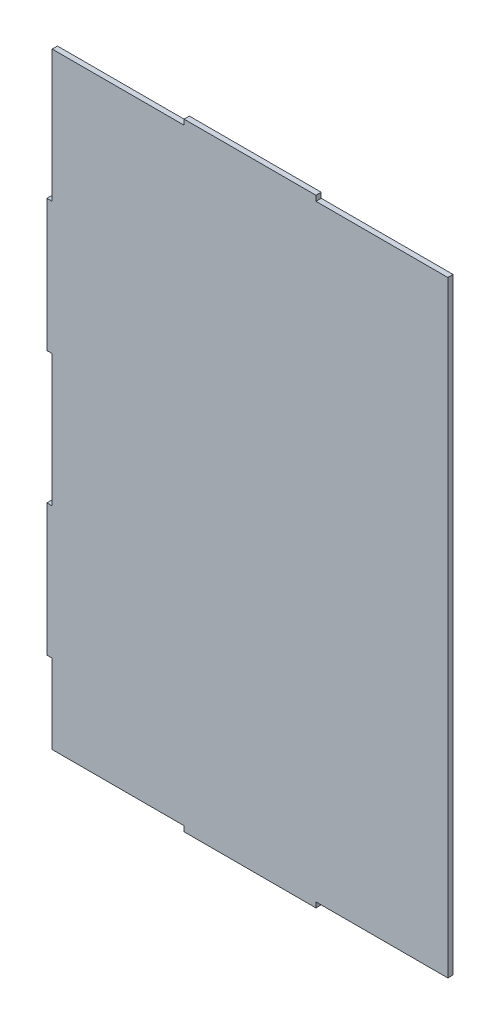
ISO-10303-21;
HEADER;
FILE_DESCRIPTION(('STEP AP214'),'2;1');
FILE_NAME('part.step','',(''),(''),'','','');
FILE_SCHEMA(('AUTOMOTIVE_DESIGN { 1 0 10303 214 1 1 1 1 }'));
ENDSEC;
DATA;
#1=APPLICATION_CONTEXT('core data for automotive mechanical design processes');
#2=APPLICATION_PROTOCOL_DEFINITION('international standard','automotive_design',2000,#1);
#3=PRODUCT_CONTEXT('',#1,'mechanical');
#4=PRODUCT('Part','Part','',(#3));
#5=PRODUCT_RELATED_PRODUCT_CATEGORY('part','',(#4));
#6=PRODUCT_DEFINITION_FORMATION('','',#4);
#7=PRODUCT_DEFINITION_CONTEXT('part definition',#1,'design');
#8=PRODUCT_DEFINITION('design','',#6,#7);
#9=PRODUCT_DEFINITION_SHAPE('','',#8);
#10=(LENGTH_UNIT() NAMED_UNIT(*) SI_UNIT(.MILLI.,.METRE.));
#11=(NAMED_UNIT(*) PLANE_ANGLE_UNIT() SI_UNIT($,.RADIAN.));
#12=(NAMED_UNIT(*) SI_UNIT($,.STERADIAN.) SOLID_ANGLE_UNIT());
#13=UNCERTAINTY_MEASURE_WITH_UNIT(LENGTH_MEASURE(1.E-05),#10,'distance_accuracy_value','');
#14=(GEOMETRIC_REPRESENTATION_CONTEXT(3) GLOBAL_UNCERTAINTY_ASSIGNED_CONTEXT((#13)) GLOBAL_UNIT_ASSIGNED_CONTEXT((#10,
#11,#12)) REPRESENTATION_CONTEXT('',''));
#15=CARTESIAN_POINT('',(0.,0.,0.));
#16=DIRECTION('',(0.,0.,1.));
#17=DIRECTION('',(1.,0.,0.));
#18=AXIS2_PLACEMENT_3D('',#15,#16,#17);
#19=CARTESIAN_POINT('',(323.463115997168,308.167929075056,4.));
#20=DIRECTION('',(1.,0.,0.));
#21=DIRECTION('',(0.,0.,-1.));
#22=AXIS2_PLACEMENT_3D('',#19,#20,#21);
#23=PLANE('',#22);
#24=DIRECTION('',(0.,-1.,0.));
#25=VECTOR('',#24,1.);
#26=CARTESIAN_POINT('',(323.463115997168,308.167929075056,0.));
#27=LINE('',#26,#25);
#28=CARTESIAN_POINT('',(323.463115997168,308.167929075056,0.));
#29=VERTEX_POINT('',#28);
#30=CARTESIAN_POINT('',(323.463115997168,208.167929075056,0.));
#31=VERTEX_POINT('',#30);
#32=EDGE_CURVE('E203',#29,#31,#27,.T.);
#33=ORIENTED_EDGE('',*,*,#32,.T.);
#34=DIRECTION('',(0.,0.,-1.));
#35=VECTOR('',#34,1.);
#36=CARTESIAN_POINT('',(323.463115997168,208.167929075056,4.));
#37=LINE('',#36,#35);
#38=CARTESIAN_POINT('',(323.463115997168,208.167929075056,4.));
#39=VERTEX_POINT('',#38);
#40=EDGE_CURVE('E11',#39,#31,#37,.T.);
#41=ORIENTED_EDGE('',*,*,#40,.F.);
#42=DIRECTION('',(0.,-1.,0.));
#43=VECTOR('',#42,1.);
#44=CARTESIAN_POINT('',(323.463115997168,308.167929075056,4.));
#45=LINE('',#44,#43);
#46=CARTESIAN_POINT('',(323.463115997168,308.167929075056,4.));
#47=VERTEX_POINT('',#46);
#48=EDGE_CURVE('E242',#47,#39,#45,.T.);
#49=ORIENTED_EDGE('',*,*,#48,.F.);
#50=DIRECTION('',(0.,0.,-1.));
#51=VECTOR('',#50,1.);
#52=CARTESIAN_POINT('',(323.463115997168,308.167929075056,4.));
#53=LINE('',#52,#51);
#54=EDGE_CURVE('E199',#47,#29,#53,.T.);
#55=ORIENTED_EDGE('',*,*,#54,.T.);
#56=EDGE_LOOP('',(#33,#41,#49,#55));
#57=FACE_BOUND('',#56,.T.);
#58=ADVANCED_FACE('F35',(#57),#23,.F.);
#59=CARTESIAN_POINT('',(323.463115997168,208.167929075056,4.));
#60=DIRECTION('',(0.,1.,0.));
#61=DIRECTION('',(0.,0.,1.));
#62=AXIS2_PLACEMENT_3D('',#59,#60,#61);
#63=PLANE('',#62);
#64=DIRECTION('',(1.,0.,0.));
#65=VECTOR('',#64,1.);
#66=CARTESIAN_POINT('',(323.463115997168,208.167929075056,0.));
#67=LINE('',#66,#65);
#68=CARTESIAN_POINT('',(327.463115997168,208.167929075056,0.));
#69=VERTEX_POINT('',#68);
#70=EDGE_CURVE('E206',#31,#69,#67,.T.);
#71=ORIENTED_EDGE('',*,*,#70,.T.);
#72=DIRECTION('',(0.,0.,-1.));
#73=VECTOR('',#72,1.);
#74=CARTESIAN_POINT('',(327.463115997168,208.167929075056,4.));
#75=LINE('',#74,#73);
#76=CARTESIAN_POINT('',(327.463115997168,208.167929075056,4.));
#77=VERTEX_POINT('',#76);
#78=EDGE_CURVE('E43',#77,#69,#75,.T.);
#79=ORIENTED_EDGE('',*,*,#78,.F.);
#80=DIRECTION('',(1.,0.,0.));
#81=VECTOR('',#80,1.);
#82=CARTESIAN_POINT('',(323.463115997168,208.167929075056,4.));
#83=LINE('',#82,#81);
#84=EDGE_CURVE('E130',#39,#77,#83,.T.);
#85=ORIENTED_EDGE('',*,*,#84,.F.);
#86=ORIENTED_EDGE('',*,*,#40,.T.);
#87=EDGE_LOOP('',(#71,#79,#85,#86));
#88=FACE_BOUND('',#87,.T.);
#89=ADVANCED_FACE('F360',(#88),#63,.F.);
#90=CARTESIAN_POINT('',(327.463115997168,208.167929075056,4.));
#91=DIRECTION('',(1.,0.,0.));
#92=DIRECTION('',(0.,1.,0.));
#93=AXIS2_PLACEMENT_3D('',#90,#91,#92);
#94=PLANE('',#93);
#95=DIRECTION('',(0.,-1.,0.));
#96=VECTOR('',#95,1.);
#97=CARTESIAN_POINT('',(327.463115997168,208.167929075056,0.));
#98=LINE('',#97,#96);
#99=CARTESIAN_POINT('',(327.463115997166,148.167929075056,0.));
#100=VERTEX_POINT('',#99);
#101=EDGE_CURVE('E208',#69,#100,#98,.T.);
#102=ORIENTED_EDGE('',*,*,#101,.T.);
#103=DIRECTION('',(0.,0.,-1.));
#104=VECTOR('',#103,1.);
#105=CARTESIAN_POINT('',(327.463115997166,148.167929075056,4.));
#106=LINE('',#105,#104);
#107=CARTESIAN_POINT('',(327.463115997166,148.167929075056,4.));
#108=VERTEX_POINT('',#107);
#109=EDGE_CURVE('E285',#108,#100,#106,.T.);
#110=ORIENTED_EDGE('',*,*,#109,.F.);
#111=DIRECTION('',(0.,-1.,0.));
#112=VECTOR('',#111,1.);
#113=CARTESIAN_POINT('',(327.463115997168,208.167929075056,4.));
#114=LINE('',#113,#112);
#115=EDGE_CURVE('E293',#77,#108,#114,.T.);
#116=ORIENTED_EDGE('',*,*,#115,.F.);
#117=ORIENTED_EDGE('',*,*,#78,.T.);
#118=EDGE_LOOP('',(#102,#110,#116,#117));
#119=FACE_BOUND('',#118,.T.);
#120=ADVANCED_FACE('F291',(#119),#94,.F.);
#121=CARTESIAN_POINT('',(327.463115997166,148.167929075056,4.));
#122=DIRECTION('',(0.,1.,0.));
#123=DIRECTION('',(0.,0.,1.));
#124=AXIS2_PLACEMENT_3D('',#121,#122,#123);
#125=PLANE('',#124);
#126=DIRECTION('',(1.,0.,0.));
#127=VECTOR('',#126,1.);
#128=CARTESIAN_POINT('',(327.463115997166,148.167929075056,0.));
#129=LINE('',#128,#127);
#130=CARTESIAN_POINT('',(427.463115997166,148.167929075056,0.));
#131=VERTEX_POINT('',#130);
#132=EDGE_CURVE('E210',#100,#131,#129,.T.);
#133=ORIENTED_EDGE('',*,*,#132,.T.);
#134=DIRECTION('',(0.,0.,-1.));
#135=VECTOR('',#134,1.);
#136=CARTESIAN_POINT('',(427.463115997166,148.167929075056,4.));
#137=LINE('',#136,#135);
#138=CARTESIAN_POINT('',(427.463115997166,148.167929075056,4.));
#139=VERTEX_POINT('',#138);
#140=EDGE_CURVE('E282',#139,#131,#137,.T.);
#141=ORIENTED_EDGE('',*,*,#140,.F.);
#142=DIRECTION('',(1.,0.,0.));
#143=VECTOR('',#142,1.);
#144=CARTESIAN_POINT('',(327.463115997166,148.167929075056,4.));
#145=LINE('',#144,#143);
#146=EDGE_CURVE('E311',#108,#139,#145,.T.);
#147=ORIENTED_EDGE('',*,*,#146,.F.);
#148=ORIENTED_EDGE('',*,*,#109,.T.);
#149=EDGE_LOOP('',(#133,#141,#147,#148));
#150=FACE_BOUND('',#149,.T.);
#151=ADVANCED_FACE('F302',(#150),#125,.F.);
#152=CARTESIAN_POINT('',(427.463115997166,148.167929075056,4.));
#153=DIRECTION('',(1.,0.,0.));
#154=DIRECTION('',(0.,0.,-1.));
#155=AXIS2_PLACEMENT_3D('',#152,#153,#154);
#156=PLANE('',#155);
#157=DIRECTION('',(0.,-1.,0.));
#158=VECTOR('',#157,1.);
#159=CARTESIAN_POINT('',(427.463115997166,148.167929075056,0.));
#160=LINE('',#159,#158);
#161=CARTESIAN_POINT('',(427.463115997166,144.167929075056,0.));
#162=VERTEX_POINT('',#161);
#163=EDGE_CURVE('E212',#131,#162,#160,.T.);
#164=ORIENTED_EDGE('',*,*,#163,.T.);
#165=DIRECTION('',(0.,0.,-1.));
#166=VECTOR('',#165,1.);
#167=CARTESIAN_POINT('',(427.463115997166,144.167929075056,4.));
#168=LINE('',#167,#166);
#169=CARTESIAN_POINT('',(427.463115997166,144.167929075056,4.));
#170=VERTEX_POINT('',#169);
#171=EDGE_CURVE('E279',#170,#162,#168,.T.);
#172=ORIENTED_EDGE('',*,*,#171,.F.);
#173=DIRECTION('',(0.,-1.,0.));
#174=VECTOR('',#173,1.);
#175=CARTESIAN_POINT('',(427.463115997166,148.167929075056,4.));
#176=LINE('',#175,#174);
#177=EDGE_CURVE('E308',#139,#170,#176,.T.);
#178=ORIENTED_EDGE('',*,*,#177,.F.);
#179=ORIENTED_EDGE('',*,*,#140,.T.);
#180=EDGE_LOOP('',(#164,#172,#178,#179));
#181=FACE_BOUND('',#180,.T.);
#182=ADVANCED_FACE('F306',(#181),#156,.F.);
#183=CARTESIAN_POINT('',(427.463115997166,144.167929075056,4.));
#184=DIRECTION('',(0.,1.,0.));
#185=DIRECTION('',(0.,0.,1.));
#186=AXIS2_PLACEMENT_3D('',#183,#184,#185);
#187=PLANE('',#186);
#188=DIRECTION('',(1.,0.,0.));
#189=VECTOR('',#188,1.);
#190=CARTESIAN_POINT('',(427.463115997166,144.167929075056,0.));
#191=LINE('',#190,#189);
#192=CARTESIAN_POINT('',(527.463115997166,144.167929075056,0.));
#193=VERTEX_POINT('',#192);
#194=EDGE_CURVE('E214',#162,#193,#191,.T.);
#195=ORIENTED_EDGE('',*,*,#194,.T.);
#196=DIRECTION('',(0.,0.,-1.));
#197=VECTOR('',#196,1.);
#198=CARTESIAN_POINT('',(527.463115997166,144.167929075056,4.));
#199=LINE('',#198,#197);
#200=CARTESIAN_POINT('',(527.463115997166,144.167929075056,4.));
#201=VERTEX_POINT('',#200);
#202=EDGE_CURVE('E276',#201,#193,#199,.T.);
#203=ORIENTED_EDGE('',*,*,#202,.F.);
#204=DIRECTION('',(1.,0.,0.));
#205=VECTOR('',#204,1.);
#206=CARTESIAN_POINT('',(427.463115997166,144.167929075056,4.));
#207=LINE('',#206,#205);
#208=EDGE_CURVE('E310',#170,#201,#207,.T.);
#209=ORIENTED_EDGE('',*,*,#208,.F.);
#210=ORIENTED_EDGE('',*,*,#171,.T.);
#211=EDGE_LOOP('',(#195,#203,#209,#210));
#212=FACE_BOUND('',#211,.T.);
#213=ADVANCED_FACE('F373',(#212),#187,.F.);
#214=CARTESIAN_POINT('',(527.463115997166,144.167929075056,4.));
#215=DIRECTION('',(-1.,0.,0.));
#216=DIRECTION('',(0.,0.,1.));
#217=AXIS2_PLACEMENT_3D('',#214,#215,#216);
#218=PLANE('',#217);
#219=DIRECTION('',(0.,1.,0.));
#220=VECTOR('',#219,1.);
#221=CARTESIAN_POINT('',(527.463115997166,144.167929075056,0.));
#222=LINE('',#221,#220);
#223=CARTESIAN_POINT('',(527.463115997166,148.167929075056,0.));
#224=VERTEX_POINT('',#223);
#225=EDGE_CURVE('E216',#193,#224,#222,.T.);
#226=ORIENTED_EDGE('',*,*,#225,.T.);
#227=DIRECTION('',(0.,0.,-1.));
#228=VECTOR('',#227,1.);
#229=CARTESIAN_POINT('',(527.463115997166,148.167929075056,4.));
#230=LINE('',#229,#228);
#231=CARTESIAN_POINT('',(527.463115997166,148.167929075056,4.));
#232=VERTEX_POINT('',#231);
#233=EDGE_CURVE('E273',#232,#224,#230,.T.);
#234=ORIENTED_EDGE('',*,*,#233,.F.);
#235=DIRECTION('',(0.,1.,0.));
#236=VECTOR('',#235,1.);
#237=CARTESIAN_POINT('',(527.463115997166,144.167929075056,4.));
#238=LINE('',#237,#236);
#239=EDGE_CURVE('E313',#201,#232,#238,.T.);
#240=ORIENTED_EDGE('',*,*,#239,.F.);
#241=ORIENTED_EDGE('',*,*,#202,.T.);
#242=EDGE_LOOP('',(#226,#234,#240,#241));
#243=FACE_BOUND('',#242,.T.);
#244=ADVANCED_FACE('F376',(#243),#218,.F.);
#245=CARTESIAN_POINT('',(527.463115997166,148.167929075056,4.));
#246=DIRECTION('',(0.,1.,0.));
#247=DIRECTION('',(0.,0.,1.));
#248=AXIS2_PLACEMENT_3D('',#245,#246,#247);
#249=PLANE('',#248);
#250=DIRECTION('',(1.,0.,0.));
#251=VECTOR('',#250,1.);
#252=CARTESIAN_POINT('',(527.463115997166,148.167929075056,0.));
#253=LINE('',#252,#251);
#254=CARTESIAN_POINT('',(627.463115997166,148.167929075056,0.));
#255=VERTEX_POINT('',#254);
#256=EDGE_CURVE('E218',#224,#255,#253,.T.);
#257=ORIENTED_EDGE('',*,*,#256,.T.);
#258=DIRECTION('',(0.,0.,-1.));
#259=VECTOR('',#258,1.);
#260=CARTESIAN_POINT('',(627.463115997166,148.167929075056,4.));
#261=LINE('',#260,#259);
#262=CARTESIAN_POINT('',(627.463115997166,148.167929075056,4.));
#263=VERTEX_POINT('',#262);
#264=EDGE_CURVE('E270',#263,#255,#261,.T.);
#265=ORIENTED_EDGE('',*,*,#264,.F.);
#266=DIRECTION('',(1.,0.,0.));
#267=VECTOR('',#266,1.);
#268=CARTESIAN_POINT('',(527.463115997166,148.167929075056,4.));
#269=LINE('',#268,#267);
#270=EDGE_CURVE('E319',#232,#263,#269,.T.);
#271=ORIENTED_EDGE('',*,*,#270,.F.);
#272=ORIENTED_EDGE('',*,*,#233,.T.);
#273=EDGE_LOOP('',(#257,#265,#271,#272));
#274=FACE_BOUND('',#273,.T.);
#275=ADVANCED_FACE('F380',(#274),#249,.F.);
#276=CARTESIAN_POINT('',(627.463115997166,508.167929075056,4.));
#277=DIRECTION('',(-1.,0.,0.));
#278=DIRECTION('',(0.,0.,1.));
#279=AXIS2_PLACEMENT_3D('',#276,#277,#278);
#280=PLANE('',#279);
#281=DIRECTION('',(0.,1.,0.));
#282=VECTOR('',#281,1.);
#283=CARTESIAN_POINT('',(627.463115997166,508.167929075056,0.));
#284=LINE('',#283,#282);
#285=CARTESIAN_POINT('',(627.463115997166,608.167929075056,0.));
#286=VERTEX_POINT('',#285);
#287=EDGE_CURVE('E221',#255,#286,#284,.T.);
#288=ORIENTED_EDGE('',*,*,#287,.T.);
#289=DIRECTION('',(0.,0.,-1.));
#290=VECTOR('',#289,1.);
#291=CARTESIAN_POINT('',(627.463115997166,608.167929075056,4.));
#292=LINE('',#291,#290);
#293=CARTESIAN_POINT('',(627.463115997166,608.167929075056,4.));
#294=VERTEX_POINT('',#293);
#295=EDGE_CURVE('E267',#294,#286,#292,.T.);
#296=ORIENTED_EDGE('',*,*,#295,.F.);
#297=DIRECTION('',(0.,1.,0.));
#298=VECTOR('',#297,1.);
#299=CARTESIAN_POINT('',(627.463115997166,148.167929075056,4.));
#300=LINE('',#299,#298);
#301=EDGE_CURVE('E321',#263,#294,#300,.T.);
#302=ORIENTED_EDGE('',*,*,#301,.F.);
#303=ORIENTED_EDGE('',*,*,#264,.T.);
#304=EDGE_LOOP('',(#288,#296,#302,#303));
#305=FACE_BOUND('',#304,.T.);
#306=ADVANCED_FACE('F384',(#305),#280,.F.);
#307=CARTESIAN_POINT('',(627.463115997166,608.167929075056,4.));
#308=DIRECTION('',(0.,-1.,0.));
#309=DIRECTION('',(0.,0.,-1.));
#310=AXIS2_PLACEMENT_3D('',#307,#308,#309);
#311=PLANE('',#310);
#312=DIRECTION('',(-1.,0.,0.));
#313=VECTOR('',#312,1.);
#314=CARTESIAN_POINT('',(627.463115997166,608.167929075056,0.));
#315=LINE('',#314,#313);
#316=CARTESIAN_POINT('',(527.463115997166,608.167929075056,0.));
#317=VERTEX_POINT('',#316);
#318=EDGE_CURVE('E223',#286,#317,#315,.T.);
#319=ORIENTED_EDGE('',*,*,#318,.T.);
#320=DIRECTION('',(0.,0.,-1.));
#321=VECTOR('',#320,1.);
#322=CARTESIAN_POINT('',(527.463115997166,608.167929075056,4.));
#323=LINE('',#322,#321);
#324=CARTESIAN_POINT('',(527.463115997166,608.167929075056,4.));
#325=VERTEX_POINT('',#324);
#326=EDGE_CURVE('E264',#325,#317,#323,.T.);
#327=ORIENTED_EDGE('',*,*,#326,.F.);
#328=DIRECTION('',(-1.,0.,0.));
#329=VECTOR('',#328,1.);
#330=CARTESIAN_POINT('',(627.463115997166,608.167929075056,4.));
#331=LINE('',#330,#329);
#332=EDGE_CURVE('E323',#294,#325,#331,.T.);
#333=ORIENTED_EDGE('',*,*,#332,.F.);
#334=ORIENTED_EDGE('',*,*,#295,.T.);
#335=EDGE_LOOP('',(#319,#327,#333,#334));
#336=FACE_BOUND('',#335,.T.);
#337=ADVANCED_FACE('F388',(#336),#311,.F.);
#338=CARTESIAN_POINT('',(527.463115997166,612.167929075056,4.));
#339=DIRECTION('',(-1.,0.,0.));
#340=DIRECTION('',(0.,0.,1.));
#341=AXIS2_PLACEMENT_3D('',#338,#339,#340);
#342=PLANE('',#341);
#343=DIRECTION('',(0.,1.,0.));
#344=VECTOR('',#343,1.);
#345=CARTESIAN_POINT('',(527.463115997166,612.167929075056,0.));
#346=LINE('',#345,#344);
#347=CARTESIAN_POINT('',(527.463115997166,612.167929075056,0.));
#348=VERTEX_POINT('',#347);
#349=EDGE_CURVE('E225',#317,#348,#346,.T.);
#350=ORIENTED_EDGE('',*,*,#349,.T.);
#351=DIRECTION('',(0.,0.,-1.));
#352=VECTOR('',#351,1.);
#353=CARTESIAN_POINT('',(527.463115997166,612.167929075056,4.));
#354=LINE('',#353,#352);
#355=CARTESIAN_POINT('',(527.463115997166,612.167929075056,4.));
#356=VERTEX_POINT('',#355);
#357=EDGE_CURVE('E261',#356,#348,#354,.T.);
#358=ORIENTED_EDGE('',*,*,#357,.F.);
#359=DIRECTION('',(0.,1.,0.));
#360=VECTOR('',#359,1.);
#361=CARTESIAN_POINT('',(527.463115997166,612.167929075056,4.));
#362=LINE('',#361,#360);
#363=EDGE_CURVE('E325',#325,#356,#362,.T.);
#364=ORIENTED_EDGE('',*,*,#363,.F.);
#365=ORIENTED_EDGE('',*,*,#326,.T.);
#366=EDGE_LOOP('',(#350,#358,#364,#365));
#367=FACE_BOUND('',#366,.T.);
#368=ADVANCED_FACE('F392',(#367),#342,.F.);
#369=CARTESIAN_POINT('',(427.463115997166,612.167929075056,4.));
#370=DIRECTION('',(0.,-1.,0.));
#371=DIRECTION('',(0.,0.,-1.));
#372=AXIS2_PLACEMENT_3D('',#369,#370,#371);
#373=PLANE('',#372);
#374=DIRECTION('',(-1.,0.,0.));
#375=VECTOR('',#374,1.);
#376=CARTESIAN_POINT('',(427.463115997166,612.167929075056,0.));
#377=LINE('',#376,#375);
#378=CARTESIAN_POINT('',(427.463115997166,612.167929075056,0.));
#379=VERTEX_POINT('',#378);
#380=EDGE_CURVE('E227',#348,#379,#377,.T.);
#381=ORIENTED_EDGE('',*,*,#380,.T.);
#382=DIRECTION('',(0.,0.,-1.));
#383=VECTOR('',#382,1.);
#384=CARTESIAN_POINT('',(427.463115997166,612.167929075056,4.));
#385=LINE('',#384,#383);
#386=CARTESIAN_POINT('',(427.463115997166,612.167929075056,4.));
#387=VERTEX_POINT('',#386);
#388=EDGE_CURVE('E258',#387,#379,#385,.T.);
#389=ORIENTED_EDGE('',*,*,#388,.F.);
#390=DIRECTION('',(-1.,0.,0.));
#391=VECTOR('',#390,1.);
#392=CARTESIAN_POINT('',(427.463115997166,612.167929075056,4.));
#393=LINE('',#392,#391);
#394=EDGE_CURVE('E327',#356,#387,#393,.T.);
#395=ORIENTED_EDGE('',*,*,#394,.F.);
#396=ORIENTED_EDGE('',*,*,#357,.T.);
#397=EDGE_LOOP('',(#381,#389,#395,#396));
#398=FACE_BOUND('',#397,.T.);
#399=ADVANCED_FACE('F396',(#398),#373,.F.);
#400=CARTESIAN_POINT('',(427.463115997166,608.167929075056,4.));
#401=DIRECTION('',(1.,0.,0.));
#402=DIRECTION('',(0.,0.,-1.));
#403=AXIS2_PLACEMENT_3D('',#400,#401,#402);
#404=PLANE('',#403);
#405=DIRECTION('',(0.,-1.,0.));
#406=VECTOR('',#405,1.);
#407=CARTESIAN_POINT('',(427.463115997166,608.167929075056,0.));
#408=LINE('',#407,#406);
#409=CARTESIAN_POINT('',(427.463115997166,608.167929075056,0.));
#410=VERTEX_POINT('',#409);
#411=EDGE_CURVE('E229',#379,#410,#408,.T.);
#412=ORIENTED_EDGE('',*,*,#411,.T.);
#413=DIRECTION('',(0.,0.,-1.));
#414=VECTOR('',#413,1.);
#415=CARTESIAN_POINT('',(427.463115997166,608.167929075056,4.));
#416=LINE('',#415,#414);
#417=CARTESIAN_POINT('',(427.463115997166,608.167929075056,4.));
#418=VERTEX_POINT('',#417);
#419=EDGE_CURVE('E255',#418,#410,#416,.T.);
#420=ORIENTED_EDGE('',*,*,#419,.F.);
#421=DIRECTION('',(0.,-1.,0.));
#422=VECTOR('',#421,1.);
#423=CARTESIAN_POINT('',(427.463115997166,608.167929075056,4.));
#424=LINE('',#423,#422);
#425=EDGE_CURVE('E329',#387,#418,#424,.T.);
#426=ORIENTED_EDGE('',*,*,#425,.F.);
#427=ORIENTED_EDGE('',*,*,#388,.T.);
#428=EDGE_LOOP('',(#412,#420,#426,#427));
#429=FACE_BOUND('',#428,.T.);
#430=ADVANCED_FACE('F400',(#429),#404,.F.);
#431=CARTESIAN_POINT('',(427.463115997166,608.167929075056,4.));
#432=DIRECTION('',(0.,-1.,0.));
#433=DIRECTION('',(0.,0.,-1.));
#434=AXIS2_PLACEMENT_3D('',#431,#432,#433);
#435=PLANE('',#434);
#436=DIRECTION('',(-1.,0.,0.));
#437=VECTOR('',#436,1.);
#438=CARTESIAN_POINT('',(427.463115997166,608.167929075056,0.));
#439=LINE('',#438,#437);
#440=CARTESIAN_POINT('',(327.463115997166,608.167929075056,0.));
#441=VERTEX_POINT('',#440);
#442=EDGE_CURVE('E231',#410,#441,#439,.T.);
#443=ORIENTED_EDGE('',*,*,#442,.T.);
#444=DIRECTION('',(0.,0.,-1.));
#445=VECTOR('',#444,1.);
#446=CARTESIAN_POINT('',(327.463115997166,608.167929075056,4.));
#447=LINE('',#446,#445);
#448=CARTESIAN_POINT('',(327.463115997166,608.167929075056,4.));
#449=VERTEX_POINT('',#448);
#450=EDGE_CURVE('E252',#449,#441,#447,.T.);
#451=ORIENTED_EDGE('',*,*,#450,.F.);
#452=DIRECTION('',(-1.,0.,0.));
#453=VECTOR('',#452,1.);
#454=CARTESIAN_POINT('',(427.463115997166,608.167929075056,4.));
#455=LINE('',#454,#453);
#456=EDGE_CURVE('E331',#418,#449,#455,.T.);
#457=ORIENTED_EDGE('',*,*,#456,.F.);
#458=ORIENTED_EDGE('',*,*,#419,.T.);
#459=EDGE_LOOP('',(#443,#451,#457,#458));
#460=FACE_BOUND('',#459,.T.);
#461=ADVANCED_FACE('F404',(#460),#435,.F.);
#462=CARTESIAN_POINT('',(327.463115997166,608.167929075056,4.));
#463=DIRECTION('',(1.,0.,0.));
#464=DIRECTION('',(0.,1.,0.));
#465=AXIS2_PLACEMENT_3D('',#462,#463,#464);
#466=PLANE('',#465);
#467=DIRECTION('',(0.,-1.,0.));
#468=VECTOR('',#467,1.);
#469=CARTESIAN_POINT('',(327.463115997166,608.167929075056,0.));
#470=LINE('',#469,#468);
#471=CARTESIAN_POINT('',(327.463115997167,508.167929075056,0.));
#472=VERTEX_POINT('',#471);
#473=EDGE_CURVE('E233',#441,#472,#470,.T.);
#474=ORIENTED_EDGE('',*,*,#473,.T.);
#475=DIRECTION('',(0.,0.,-1.));
#476=VECTOR('',#475,1.);
#477=CARTESIAN_POINT('',(327.463115997167,508.167929075056,4.));
#478=LINE('',#477,#476);
#479=CARTESIAN_POINT('',(327.463115997167,508.167929075056,4.));
#480=VERTEX_POINT('',#479);
#481=EDGE_CURVE('E249',#480,#472,#478,.T.);
#482=ORIENTED_EDGE('',*,*,#481,.F.);
#483=DIRECTION('',(0.,-1.,0.));
#484=VECTOR('',#483,1.);
#485=CARTESIAN_POINT('',(327.463115997166,608.167929075056,4.));
#486=LINE('',#485,#484);
#487=EDGE_CURVE('E333',#449,#480,#486,.T.);
#488=ORIENTED_EDGE('',*,*,#487,.F.);
#489=ORIENTED_EDGE('',*,*,#450,.T.);
#490=EDGE_LOOP('',(#474,#482,#488,#489));
#491=FACE_BOUND('',#490,.T.);
#492=ADVANCED_FACE('F408',(#491),#466,.F.);
#493=CARTESIAN_POINT('',(327.463115997167,508.167929075056,4.));
#494=DIRECTION('',(0.,-1.,0.));
#495=DIRECTION('',(0.,0.,-1.));
#496=AXIS2_PLACEMENT_3D('',#493,#494,#495);
#497=PLANE('',#496);
#498=DIRECTION('',(-1.,0.,0.));
#499=VECTOR('',#498,1.);
#500=CARTESIAN_POINT('',(327.463115997167,508.167929075056,0.));
#501=LINE('',#500,#499);
#502=CARTESIAN_POINT('',(323.463115997167,508.167929075056,0.));
#503=VERTEX_POINT('',#502);
#504=EDGE_CURVE('E235',#472,#503,#501,.T.);
#505=ORIENTED_EDGE('',*,*,#504,.T.);
#506=DIRECTION('',(0.,0.,-1.));
#507=VECTOR('',#506,1.);
#508=CARTESIAN_POINT('',(323.463115997167,508.167929075056,4.));
#509=LINE('',#508,#507);
#510=CARTESIAN_POINT('',(323.463115997167,508.167929075056,4.));
#511=VERTEX_POINT('',#510);
#512=EDGE_CURVE('E246',#511,#503,#509,.T.);
#513=ORIENTED_EDGE('',*,*,#512,.F.);
#514=DIRECTION('',(-1.,0.,0.));
#515=VECTOR('',#514,1.);
#516=CARTESIAN_POINT('',(327.463115997167,508.167929075056,4.));
#517=LINE('',#516,#515);
#518=EDGE_CURVE('E335',#480,#511,#517,.T.);
#519=ORIENTED_EDGE('',*,*,#518,.F.);
#520=ORIENTED_EDGE('',*,*,#481,.T.);
#521=EDGE_LOOP('',(#505,#513,#519,#520));
#522=FACE_BOUND('',#521,.T.);
#523=ADVANCED_FACE('F341',(#522),#497,.F.);
#524=CARTESIAN_POINT('',(323.463115997167,508.167929075056,4.));
#525=DIRECTION('',(1.,0.,0.));
#526=DIRECTION('',(0.,1.,0.));
#527=AXIS2_PLACEMENT_3D('',#524,#525,#526);
#528=PLANE('',#527);
#529=DIRECTION('',(0.,-1.,0.));
#530=VECTOR('',#529,1.);
#531=CARTESIAN_POINT('',(323.463115997167,508.167929075056,0.));
#532=LINE('',#531,#530);
#533=CARTESIAN_POINT('',(323.463115997167,408.167929075056,0.));
#534=VERTEX_POINT('',#533);
#535=EDGE_CURVE('E237',#503,#534,#532,.T.);
#536=ORIENTED_EDGE('',*,*,#535,.T.);
#537=DIRECTION('',(0.,0.,-1.));
#538=VECTOR('',#537,1.);
#539=CARTESIAN_POINT('',(323.463115997167,408.167929075056,4.));
#540=LINE('',#539,#538);
#541=CARTESIAN_POINT('',(323.463115997167,408.167929075056,4.));
#542=VERTEX_POINT('',#541);
#543=EDGE_CURVE('E194',#542,#534,#540,.T.);
#544=ORIENTED_EDGE('',*,*,#543,.F.);
#545=DIRECTION('',(0.,-1.,0.));
#546=VECTOR('',#545,1.);
#547=CARTESIAN_POINT('',(323.463115997167,508.167929075056,4.));
#548=LINE('',#547,#546);
#549=EDGE_CURVE('E185',#511,#542,#548,.T.);
#550=ORIENTED_EDGE('',*,*,#549,.F.);
#551=ORIENTED_EDGE('',*,*,#512,.T.);
#552=EDGE_LOOP('',(#536,#544,#550,#551));
#553=FACE_BOUND('',#552,.T.);
#554=ADVANCED_FACE('F345',(#553),#528,.F.);
#555=CARTESIAN_POINT('',(323.463115997167,408.167929075056,4.));
#556=DIRECTION('',(0.,1.,0.));
#557=DIRECTION('',(0.,0.,1.));
#558=AXIS2_PLACEMENT_3D('',#555,#556,#557);
#559=PLANE('',#558);
#560=DIRECTION('',(1.,0.,0.));
#561=VECTOR('',#560,1.);
#562=CARTESIAN_POINT('',(323.463115997167,408.167929075056,0.));
#563=LINE('',#562,#561);
#564=CARTESIAN_POINT('',(327.463115997167,408.167929075056,0.));
#565=VERTEX_POINT('',#564);
#566=EDGE_CURVE('E193',#534,#565,#563,.T.);
#567=ORIENTED_EDGE('',*,*,#566,.T.);
#568=DIRECTION('',(0.,0.,-1.));
#569=VECTOR('',#568,1.);
#570=CARTESIAN_POINT('',(327.463115997167,408.167929075056,4.));
#571=LINE('',#570,#569);
#572=CARTESIAN_POINT('',(327.463115997167,408.167929075056,4.));
#573=VERTEX_POINT('',#572);
#574=EDGE_CURVE('E190',#573,#565,#571,.T.);
#575=ORIENTED_EDGE('',*,*,#574,.F.);
#576=DIRECTION('',(1.,0.,0.));
#577=VECTOR('',#576,1.);
#578=CARTESIAN_POINT('',(323.463115997167,408.167929075056,4.));
#579=LINE('',#578,#577);
#580=EDGE_CURVE('E179',#542,#573,#579,.T.);
#581=ORIENTED_EDGE('',*,*,#580,.F.);
#582=ORIENTED_EDGE('',*,*,#543,.T.);
#583=EDGE_LOOP('',(#567,#575,#581,#582));
#584=FACE_BOUND('',#583,.T.);
#585=ADVANCED_FACE('F191',(#584),#559,.F.);
#586=CARTESIAN_POINT('',(327.463115997167,408.167929075056,4.));
#587=DIRECTION('',(1.,0.,0.));
#588=DIRECTION('',(0.,1.,0.));
#589=AXIS2_PLACEMENT_3D('',#586,#587,#588);
#590=PLANE('',#589);
#591=DIRECTION('',(0.,-1.,0.));
#592=VECTOR('',#591,1.);
#593=CARTESIAN_POINT('',(327.463115997167,408.167929075056,0.));
#594=LINE('',#593,#592);
#595=CARTESIAN_POINT('',(327.463115997168,308.167929075056,0.));
#596=VERTEX_POINT('',#595);
#597=EDGE_CURVE('E116',#565,#596,#594,.T.);
#598=ORIENTED_EDGE('',*,*,#597,.T.);
#599=DIRECTION('',(0.,0.,-1.));
#600=VECTOR('',#599,1.);
#601=CARTESIAN_POINT('',(327.463115997168,308.167929075056,4.));
#602=LINE('',#601,#600);
#603=CARTESIAN_POINT('',(327.463115997168,308.167929075056,4.));
#604=VERTEX_POINT('',#603);
#605=EDGE_CURVE('E195',#604,#596,#602,.T.);
#606=ORIENTED_EDGE('',*,*,#605,.F.);
#607=DIRECTION('',(0.,-1.,0.));
#608=VECTOR('',#607,1.);
#609=CARTESIAN_POINT('',(327.463115997167,408.167929075056,4.));
#610=LINE('',#609,#608);
#611=EDGE_CURVE('E183',#573,#604,#610,.T.);
#612=ORIENTED_EDGE('',*,*,#611,.F.);
#613=ORIENTED_EDGE('',*,*,#574,.T.);
#614=EDGE_LOOP('',(#598,#606,#612,#613));
#615=FACE_BOUND('',#614,.T.);
#616=ADVANCED_FACE('F197',(#615),#590,.F.);
#617=CARTESIAN_POINT('',(327.463115997168,308.167929075056,4.));
#618=DIRECTION('',(0.,-1.,0.));
#619=DIRECTION('',(0.,0.,-1.));
#620=AXIS2_PLACEMENT_3D('',#617,#618,#619);
#621=PLANE('',#620);
#622=DIRECTION('',(-1.,0.,0.));
#623=VECTOR('',#622,1.);
#624=CARTESIAN_POINT('',(327.463115997168,308.167929075056,0.));
#625=LINE('',#624,#623);
#626=EDGE_CURVE('E122',#596,#29,#625,.T.);
#627=ORIENTED_EDGE('',*,*,#626,.T.);
#628=ORIENTED_EDGE('',*,*,#54,.F.);
#629=DIRECTION('',(-1.,0.,0.));
#630=VECTOR('',#629,1.);
#631=CARTESIAN_POINT('',(327.463115997168,308.167929075056,4.));
#632=LINE('',#631,#630);
#633=EDGE_CURVE('E51',#604,#47,#632,.T.);
#634=ORIENTED_EDGE('',*,*,#633,.F.);
#635=ORIENTED_EDGE('',*,*,#605,.T.);
#636=EDGE_LOOP('',(#627,#628,#634,#635));
#637=FACE_BOUND('',#636,.T.);
#638=ADVANCED_FACE('F349',(#637),#621,.F.);
#639=CARTESIAN_POINT('',(0.,0.,4.));
#640=DIRECTION('',(0.,0.,1.));
#641=DIRECTION('',(1.,0.,0.));
#642=AXIS2_PLACEMENT_3D('',#639,#640,#641);
#643=PLANE('',#642);
#644=ORIENTED_EDGE('',*,*,#48,.T.);
#645=ORIENTED_EDGE('',*,*,#84,.T.);
#646=ORIENTED_EDGE('',*,*,#115,.T.);
#647=ORIENTED_EDGE('',*,*,#146,.T.);
#648=ORIENTED_EDGE('',*,*,#177,.T.);
#649=ORIENTED_EDGE('',*,*,#208,.T.);
#650=ORIENTED_EDGE('',*,*,#239,.T.);
#651=ORIENTED_EDGE('',*,*,#270,.T.);
#652=ORIENTED_EDGE('',*,*,#301,.T.);
#653=ORIENTED_EDGE('',*,*,#332,.T.);
#654=ORIENTED_EDGE('',*,*,#363,.T.);
#655=ORIENTED_EDGE('',*,*,#394,.T.);
#656=ORIENTED_EDGE('',*,*,#425,.T.);
#657=ORIENTED_EDGE('',*,*,#456,.T.);
#658=ORIENTED_EDGE('',*,*,#487,.T.);
#659=ORIENTED_EDGE('',*,*,#518,.T.);
#660=ORIENTED_EDGE('',*,*,#549,.T.);
#661=ORIENTED_EDGE('',*,*,#580,.T.);
#662=ORIENTED_EDGE('',*,*,#611,.T.);
#663=ORIENTED_EDGE('',*,*,#633,.T.);
#664=EDGE_LOOP('',(#644,#645,#646,#647,#648,#649,#650,#651,#652,#653,#654,#655,#656,#657,#658,
#659,#660,#661,#662,#663));
#665=FACE_BOUND('',#664,.T.);
#666=ADVANCED_FACE('F181',(#665),#643,.T.);
#667=CARTESIAN_POINT('',(0.,0.,0.));
#668=DIRECTION('',(0.,0.,1.));
#669=DIRECTION('',(1.,0.,0.));
#670=AXIS2_PLACEMENT_3D('',#667,#668,#669);
#671=PLANE('',#670);
#672=ORIENTED_EDGE('',*,*,#32,.F.);
#673=ORIENTED_EDGE('',*,*,#626,.F.);
#674=ORIENTED_EDGE('',*,*,#597,.F.);
#675=ORIENTED_EDGE('',*,*,#566,.F.);
#676=ORIENTED_EDGE('',*,*,#535,.F.);
#677=ORIENTED_EDGE('',*,*,#504,.F.);
#678=ORIENTED_EDGE('',*,*,#473,.F.);
#679=ORIENTED_EDGE('',*,*,#442,.F.);
#680=ORIENTED_EDGE('',*,*,#411,.F.);
#681=ORIENTED_EDGE('',*,*,#380,.F.);
#682=ORIENTED_EDGE('',*,*,#349,.F.);
#683=ORIENTED_EDGE('',*,*,#318,.F.);
#684=ORIENTED_EDGE('',*,*,#287,.F.);
#685=ORIENTED_EDGE('',*,*,#256,.F.);
#686=ORIENTED_EDGE('',*,*,#225,.F.);
#687=ORIENTED_EDGE('',*,*,#194,.F.);
#688=ORIENTED_EDGE('',*,*,#163,.F.);
#689=ORIENTED_EDGE('',*,*,#132,.F.);
#690=ORIENTED_EDGE('',*,*,#101,.F.);
#691=ORIENTED_EDGE('',*,*,#70,.F.);
#692=EDGE_LOOP('',(#672,#673,#674,#675,#676,#677,#678,#679,#680,#681,#682,#683,#684,#685,#686,
#687,#688,#689,#690,#691));
#693=FACE_BOUND('',#692,.T.);
#694=ADVANCED_FACE('F297',(#693),#671,.F.);
#695=CLOSED_SHELL('',(#58,#89,#120,#151,#182,#213,#244,#275,#306,#337,#368,#399,#430,#461,#492,
#523,#554,#585,#616,#638,#666,#694));
#696=MANIFOLD_SOLID_BREP('B2',#695);
#697=ADVANCED_BREP_SHAPE_REPRESENTATION('',(#18,#696),#14);
#698=SHAPE_DEFINITION_REPRESENTATION(#9,#697);
ENDSEC;
END-ISO-10303-21;
